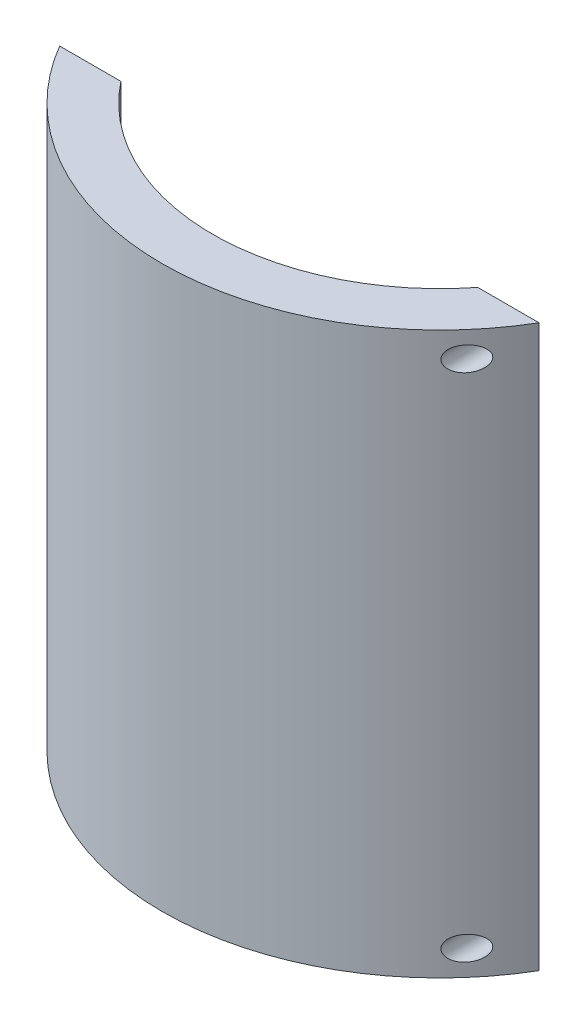
ISO-10303-21;
HEADER;
FILE_DESCRIPTION(('STEP AP214'),'2;1');
FILE_NAME('part.step','',(''),(''),'','','');
FILE_SCHEMA(('AUTOMOTIVE_DESIGN { 1 0 10303 214 1 1 1 1 }'));
ENDSEC;
DATA;
#1=APPLICATION_CONTEXT('core data for automotive mechanical design processes');
#2=APPLICATION_PROTOCOL_DEFINITION('international standard','automotive_design',2000,#1);
#3=PRODUCT_CONTEXT('',#1,'mechanical');
#4=PRODUCT('Part','Part','',(#3));
#5=PRODUCT_RELATED_PRODUCT_CATEGORY('part','',(#4));
#6=PRODUCT_DEFINITION_FORMATION('','',#4);
#7=PRODUCT_DEFINITION_CONTEXT('part definition',#1,'design');
#8=PRODUCT_DEFINITION('design','',#6,#7);
#9=PRODUCT_DEFINITION_SHAPE('','',#8);
#10=(LENGTH_UNIT() NAMED_UNIT(*) SI_UNIT(.MILLI.,.METRE.));
#11=(NAMED_UNIT(*) PLANE_ANGLE_UNIT() SI_UNIT($,.RADIAN.));
#12=(NAMED_UNIT(*) SI_UNIT($,.STERADIAN.) SOLID_ANGLE_UNIT());
#13=UNCERTAINTY_MEASURE_WITH_UNIT(LENGTH_MEASURE(1.E-05),#10,'distance_accuracy_value','');
#14=(GEOMETRIC_REPRESENTATION_CONTEXT(3) GLOBAL_UNCERTAINTY_ASSIGNED_CONTEXT((#13)) GLOBAL_UNIT_ASSIGNED_CONTEXT((#10,
#11,#12)) REPRESENTATION_CONTEXT('',''));
#15=CARTESIAN_POINT('',(0.,0.,0.));
#16=DIRECTION('',(0.,0.,1.));
#17=DIRECTION('',(1.,0.,0.));
#18=AXIS2_PLACEMENT_3D('',#15,#16,#17);
#19=CARTESIAN_POINT('',(0.,100.,0.));
#20=DIRECTION('',(0.,-1.,0.));
#21=DIRECTION('',(0.,0.,-1.));
#22=AXIS2_PLACEMENT_3D('',#19,#20,#21);
#23=CYLINDRICAL_SURFACE('',#22,49.53);
#24=CARTESIAN_POINT('',(-39.4074213026585,95.4875,30.0046004185155));
#25=CARTESIAN_POINT('',(-39.4074138231164,95.5760868129722,30.0046106623828));
#26=CARTESIAN_POINT('',(-39.4018732165979,95.6648574769952,30.0118914222295));
#27=CARTESIAN_POINT('',(-39.380325323203,95.8389843560618,30.0401592760915));
#28=CARTESIAN_POINT('',(-39.3642834079076,95.9243282796565,30.0611917164601));
#29=CARTESIAN_POINT('',(-39.3235497119811,96.0880486339832,30.1144555127511));
#30=CARTESIAN_POINT('',(-39.2989550782755,96.1664914129335,30.1465610614093));
#31=CARTESIAN_POINT('',(-39.2428451637457,96.3163587797536,30.2195653243151));
#32=CARTESIAN_POINT('',(-39.2113295048654,96.38778298393,30.2604645189069));
#33=CARTESIAN_POINT('',(-39.1234940657775,96.5619603112001,30.3740138610011));
#34=CARTESIAN_POINT('',(-39.063237154635,96.6595381602939,30.4515250234117));
#35=CARTESIAN_POINT('',(-38.9336345864392,96.8384508072716,30.6170560879879));
#36=CARTESIAN_POINT('',(-38.8642635793413,96.919738641746,30.7051052374441));
#37=CARTESIAN_POINT('',(-38.735223910005,97.0511756845679,30.8676467657953));
#38=CARTESIAN_POINT('',(-38.6768065524496,97.104234656769,30.9408258600599));
#39=CARTESIAN_POINT('',(-38.5568755767306,97.2021181689345,31.0901498276415));
#40=CARTESIAN_POINT('',(-38.4953603277594,97.2469383128071,31.1662962581658));
#41=CARTESIAN_POINT('',(-38.3697923598375,97.3289008284305,31.3207576197371));
#42=CARTESIAN_POINT('',(-38.3057365649727,97.3660335322998,31.3990751425921));
#43=CARTESIAN_POINT('',(-38.1756040575122,97.4329546408861,31.5571647116969));
#44=CARTESIAN_POINT('',(-38.1095269088684,97.4627414482017,31.6369370702647));
#45=CARTESIAN_POINT('',(-37.9564997982464,97.5227766544738,31.8204823103111));
#46=CARTESIAN_POINT('',(-37.8690061634527,97.550700007981,31.9245673144918));
#47=CARTESIAN_POINT('',(-37.6919351668351,97.5951125576892,32.133435661651));
#48=CARTESIAN_POINT('',(-37.6023571242215,97.6115979623823,32.2382192245818));
#49=CARTESIAN_POINT('',(-37.4217490065982,97.633138640976,32.4476919097323));
#50=CARTESIAN_POINT('',(-37.3307191892058,97.6381959205614,32.5523810453002));
#51=CARTESIAN_POINT('',(-37.1478653498557,97.6366512111041,32.7608951322289));
#52=CARTESIAN_POINT('',(-37.0560415908326,97.6300529452326,32.8647203489108));
#53=CARTESIAN_POINT('',(-36.8184113938012,97.5973435113219,33.1311524029261));
#54=CARTESIAN_POINT('',(-36.6724497812492,97.5620753193793,33.2926145437908));
#55=CARTESIAN_POINT('',(-36.3840203201293,97.4580637085691,33.6075781105172));
#56=CARTESIAN_POINT('',(-36.2415461676194,97.3893862310197,33.7610945614783));
#57=CARTESIAN_POINT('',(-36.0096410956516,97.241916493566,34.0080242092027));
#58=CARTESIAN_POINT('',(-35.9176932566001,97.1732041402113,34.1050826890571));
#59=CARTESIAN_POINT('',(-35.7412139110342,97.0163927006863,34.2899801725934));
#60=CARTESIAN_POINT('',(-35.6566726793137,96.9283195862632,34.3778312966434));
#61=CARTESIAN_POINT('',(-35.5183512478225,96.7552835096315,34.5206467005145));
#62=CARTESIAN_POINT('',(-35.4620649684157,96.6746748913579,34.5784369836505));
#63=CARTESIAN_POINT('',(-35.3589425380408,96.5015934598034,34.6838795803548));
#64=CARTESIAN_POINT('',(-35.3120938689752,96.409136632121,34.7315453277914));
#65=CARTESIAN_POINT('',(-35.2383324150464,96.2313287723595,34.8063655728462));
#66=CARTESIAN_POINT('',(-35.209342304374,96.1477545281004,34.8356751263186));
#67=CARTESIAN_POINT('',(-35.1614789616455,95.9748896511483,34.8839857617827));
#68=CARTESIAN_POINT('',(-35.1425994740157,95.8856025914239,34.9029932179039));
#69=CARTESIAN_POINT('',(-35.1162751766008,95.7031863861163,34.9294786914514));
#70=CARTESIAN_POINT('',(-35.1088872005874,95.6100404686669,34.9368994048088));
#71=CARTESIAN_POINT('',(-35.1063527542239,95.4234150648437,34.9394462242066));
#72=CARTESIAN_POINT('',(-35.1112044871775,95.3299356294393,34.9345741347371));
#73=CARTESIAN_POINT('',(-35.1318539376337,95.1532182214903,34.9138070024389));
#74=CARTESIAN_POINT('',(-35.1467418027374,95.0697604628312,34.898828121165));
#75=CARTESIAN_POINT('',(-35.1855208815022,94.9072289131094,34.8597299611378));
#76=CARTESIAN_POINT('',(-35.2094135570962,94.8281558362933,34.8356091981945));
#77=CARTESIAN_POINT('',(-35.2667974726932,94.6705357178912,34.7775166073731));
#78=CARTESIAN_POINT('',(-35.3008358573577,94.5923988985596,34.7429813474109));
#79=CARTESIAN_POINT('',(-35.3760037144262,94.4435980765386,34.6664412705542));
#80=CARTESIAN_POINT('',(-35.417137382314,94.3729385353227,34.6244320337876));
#81=CARTESIAN_POINT('',(-35.5299264067506,94.2014339552819,34.5087651492001));
#82=CARTESIAN_POINT('',(-35.6056500593238,94.1062317172952,34.4306817284873));
#83=CARTESIAN_POINT('',(-35.7660751274733,93.9343495737967,34.2640083456365));
#84=CARTESIAN_POINT('',(-35.8507990044313,93.8577176531012,34.1753920283989));
#85=CARTESIAN_POINT('',(-36.0626614322262,93.6931048909754,33.9519927704));
#86=CARTESIAN_POINT('',(-36.1926527419706,93.6139050600469,33.813467609748));
#87=CARTESIAN_POINT('',(-36.457695064856,93.4863485978922,33.5275344915405));
#88=CARTESIAN_POINT('',(-36.5927520073855,93.438029386331,33.3801159931773));
#89=CARTESIAN_POINT('',(-36.8177287101173,93.3809282007733,33.1314589024013));
#90=CARTESIAN_POINT('',(-36.9073247580851,93.3642811059893,33.0316275869655));
#91=CARTESIAN_POINT('',(-37.0863471987778,93.3424193311821,32.8305019741674));
#92=CARTESIAN_POINT('',(-37.1757735271239,93.3372083572626,32.7292072132478));
#93=CARTESIAN_POINT('',(-37.3539759341414,93.337817476613,32.5256780091543));
#94=CARTESIAN_POINT('',(-37.4427499871171,93.3436635604049,32.4234419155044));
#95=CARTESIAN_POINT('',(-37.6188530062927,93.3662393623677,32.218954049226));
#96=CARTESIAN_POINT('',(-37.7061821999941,93.3829673500704,32.1167022816743));
#97=CARTESIAN_POINT('',(-37.8798218577766,93.4275862056203,31.9117257234516));
#98=CARTESIAN_POINT('',(-37.9661097342875,93.4556008069972,31.8090085980288));
#99=CARTESIAN_POINT('',(-38.1360494806427,93.523097654805,31.6050668334092));
#100=CARTESIAN_POINT('',(-38.2197002171455,93.5625847591659,31.5038428455871));
#101=CARTESIAN_POINT('',(-38.3832054348917,93.6534269681223,31.3044244922944));
#102=CARTESIAN_POINT('',(-38.4630742545531,93.704732043577,31.2062192798366));
#103=CARTESIAN_POINT('',(-38.6182614236944,93.8201790706429,31.0139646651233));
#104=CARTESIAN_POINT('',(-38.6935851780397,93.8843053677164,30.9199103639727));
#105=CARTESIAN_POINT('',(-38.8306499406241,94.0192667175621,30.7475584949108));
#106=CARTESIAN_POINT('',(-38.8929871489425,94.0886945015833,30.6686426018036));
#107=CARTESIAN_POINT('',(-39.0111624109502,94.2400631846726,30.5181785397325));
#108=CARTESIAN_POINT('',(-39.0670058740575,94.3219935353627,30.4466242442241));
#109=CARTESIAN_POINT('',(-39.1607343936026,94.4839725222935,30.3259390981216));
#110=CARTESIAN_POINT('',(-39.2000539395629,94.5618761447576,30.2750721991341));
#111=CARTESIAN_POINT('',(-39.2704389726716,94.7270542391685,30.1837182464972));
#112=CARTESIAN_POINT('',(-39.3015149387161,94.8143166144696,30.1432180174889));
#113=CARTESIAN_POINT('',(-39.3471431700817,94.9766166224877,30.0836220095453));
#114=CARTESIAN_POINT('',(-39.3638356077838,95.050033214707,30.0617661161455));
#115=CARTESIAN_POINT('',(-39.3895127343172,95.2003500996871,30.0281142732415));
#116=CARTESIAN_POINT('',(-39.3985194966368,95.2772397434504,30.0162895145977));
#117=CARTESIAN_POINT('',(-39.4046836715937,95.3767864694956,30.0081956538399));
#118=CARTESIAN_POINT('',(-39.4057084934667,95.3988906922526,30.0068498868564));
#119=CARTESIAN_POINT('',(-39.407078309968,95.4431594291627,30.0050509019545));
#120=CARTESIAN_POINT('',(-39.4074231750214,95.4653239540016,30.0045978541556));
#121=CARTESIAN_POINT('',(-39.4074213026585,95.4875,30.0046004185155));
#122=B_SPLINE_CURVE_WITH_KNOTS('',3,(#24,#25,#26,#27,#28,#29,#30,#31,#32,#33,#34,#35,#36,#37,
#38,#39,#40,#41,#42,#43,#44,#45,#46,#47,#48,#49,#50,#51,#52,#53,#54,#55,#56,#57,#58,#59,#60,#61,
#62,#63,#64,#65,#66,#67,#68,#69,#70,#71,#72,#73,#74,#75,#76,#77,#78,#79,#80,#81,#82,#83,#84,#85,
#86,#87,#88,#89,#90,#91,#92,#93,#94,#95,#96,#97,#98,#99,#100,#101,#102,#103,#104,#105,#106,#107,
#108,#109,#110,#111,#112,#113,#114,#115,#116,#117,#118,#119,#120,#121),.UNSPECIFIED.,.T.,.F.,(4,
2,2,2,2,2,2,2,2,2,2,2,2,2,2,2,2,2,2,2,2,2,2,2,2,2,2,2,2,2,2,2,2,2,2,2,2,2,2,2,2,2,2,2,2,2,2,2,
4),(0.,0.265642847989677,0.53216610490517,0.795755908641338,1.05936011436871,1.47230402326807,
1.88642182666588,2.20887407933402,2.53149789048016,2.85452500768746,3.17762230692878,
3.59352643056691,4.00956835438167,4.42553725538738,4.84137330603983,5.50047583259071,
6.15828270661571,6.60790597471601,7.05692973099748,7.39786992096962,7.73835486446586,
8.01677542098895,8.29502351549374,8.57464341969228,8.85422228020193,9.11136036662956,
9.36854021747783,9.64340825488554,9.91843938409714,10.3496426033114,10.7819484263127,
11.396064542911,12.010923412259,12.4159723627421,12.8211525580639,13.2272863465089,
13.6333555662988,14.044003164276,14.454824901405,14.8639384651731,15.2725555242503,
15.6383517570677,16.0038410578006,16.3058463735576,16.6074659328711,16.8417375515072,
17.0753340485162,17.1418200812611,17.2083187825746),.UNSPECIFIED.);
#123=CARTESIAN_POINT('',(-39.4074213026585,95.4875,30.0046004185155));
#124=VERTEX_POINT('',#123);
#125=EDGE_CURVE('E164',#124,#124,#122,.T.);
#126=ORIENTED_EDGE('',*,*,#125,.T.);
#127=EDGE_LOOP('',(#126));
#128=FACE_BOUND('',#127,.T.);
#129=CARTESIAN_POINT('',(35.1074213026585,4.5125,34.9383724503252));
#130=CARTESIAN_POINT('',(35.107429595275,4.607648641169,34.9383645722318));
#131=CARTESIAN_POINT('',(35.1137985669393,4.70293165044877,34.9319679330003));
#132=CARTESIAN_POINT('',(35.1387547842894,4.89030288594975,34.9068632967998));
#133=CARTESIAN_POINT('',(35.1573682494875,4.98238380895426,34.8881288804715));
#134=CARTESIAN_POINT('',(35.2051898288034,5.15999417959315,34.8398713846146));
#135=CARTESIAN_POINT('',(35.2343247087403,5.24556408049264,34.8104228701065));
#136=CARTESIAN_POINT('',(35.3013546509561,5.40923954916148,34.7424457787171));
#137=CARTESIAN_POINT('',(35.3392511108243,5.48734392326702,34.7039157531941));
#138=CARTESIAN_POINT('',(35.4384275345719,5.66479858753594,34.6026807808897));
#139=CARTESIAN_POINT('',(35.5030195204092,5.76028325302555,34.5364495438225));
#140=CARTESIAN_POINT('',(35.6415780608479,5.93519398446631,34.3934411804617));
#141=CARTESIAN_POINT('',(35.7155641643841,6.01458564007963,34.3166420338599));
#142=CARTESIAN_POINT('',(35.9015801198949,6.18771526217042,34.1221647858421));
#143=CARTESIAN_POINT('',(36.0167053729792,6.27384331620684,34.0007002291642));
#144=CARTESIAN_POINT('',(36.2534047213287,6.41874118481925,33.7482096325389));
#145=CARTESIAN_POINT('',(36.3749888337179,6.47746703436828,33.6171686146759));
#146=CARTESIAN_POINT('',(36.5822048151743,6.55570540057249,33.3912986258704));
#147=CARTESIAN_POINT('',(36.6671492034687,6.58174011667513,33.2980063924323));
#148=CARTESIAN_POINT('',(36.8375261678406,6.62292041525108,33.1094201391493));
#149=CARTESIAN_POINT('',(36.9229589117807,6.63806199434846,33.0141253965838));
#150=CARTESIAN_POINT('',(37.0937172964743,6.65798357485536,32.8221506459239));
#151=CARTESIAN_POINT('',(37.1790426223491,6.66274911603871,32.7254688933741));
#152=CARTESIAN_POINT('',(37.3489056683861,6.66223091195811,32.531473446686));
#153=CARTESIAN_POINT('',(37.4334434930271,6.65694851940919,32.4341598393697));
#154=CARTESIAN_POINT('',(37.6027887559117,6.63632458287057,32.2376845399482));
#155=CARTESIAN_POINT('',(37.6875726441901,6.62080012219108,32.1385217223893));
#156=CARTESIAN_POINT('',(37.8553284136661,6.57949577378703,31.9407549570769));
#157=CARTESIAN_POINT('',(37.9382998893924,6.5537136155118,31.8421511379627));
#158=CARTESIAN_POINT('',(38.1017093262379,6.49171755906566,31.6464352265446));
#159=CARTESIAN_POINT('',(38.1821516966005,6.45552307722344,31.5493207088744));
#160=CARTESIAN_POINT('',(38.3399517869156,6.3722264243901,31.3573663638389));
#161=CARTESIAN_POINT('',(38.417311301015,6.3251307096119,31.2625252266186));
#162=CARTESIAN_POINT('',(38.5811016718747,6.21015903153788,31.060250815592));
#163=CARTESIAN_POINT('',(38.6668099471602,6.14010365393339,30.9534509063295));
#164=CARTESIAN_POINT('',(38.8307861552442,5.98218251117819,30.7474907277623));
#165=CARTESIAN_POINT('',(38.9090628847949,5.89433819889874,30.6483214530898));
#166=CARTESIAN_POINT('',(39.0358207822244,5.72408277329454,30.4866081734568));
#167=CARTESIAN_POINT('',(39.086755146623,5.64620520104136,30.4212483760594));
#168=CARTESIAN_POINT('',(39.1804869857688,5.47867524618002,30.300431517573));
#169=CARTESIAN_POINT('',(39.2232983773537,5.38904345566584,30.2449575295308));
#170=CARTESIAN_POINT('',(39.288050968751,5.22298120358018,30.1607694991279));
#171=CARTESIAN_POINT('',(39.3125241659815,5.14918234360227,30.128848215701));
#172=CARTESIAN_POINT('',(39.3538427993996,4.9960165320773,30.0748585510629));
#173=CARTESIAN_POINT('',(39.3706954943331,4.91665496276928,30.0527807938937));
#174=CARTESIAN_POINT('',(39.3954806986278,4.75345198860808,30.0202837879126));
#175=CARTESIAN_POINT('',(39.4033380561212,4.66957888437785,30.0099627646759));
#176=CARTESIAN_POINT('',(39.409042447484,4.50091346040258,30.0024716081159));
#177=CARTESIAN_POINT('',(39.4068939533663,4.41612156820294,30.0052955997626));
#178=CARTESIAN_POINT('',(39.3936996796875,4.25897020950953,30.0226149925182));
#179=CARTESIAN_POINT('',(39.3837605378003,4.18634666574626,30.0356586305719));
#180=CARTESIAN_POINT('',(39.3571231905393,4.04456490517971,30.0705542735786));
#181=CARTESIAN_POINT('',(39.3404218503801,3.97540831230039,30.0924103637435));
#182=CARTESIAN_POINT('',(39.2937508719582,3.81596551829538,30.1533415241384));
#183=CARTESIAN_POINT('',(39.2611490876691,3.72775114254554,30.1958057057852));
#184=CARTESIAN_POINT('',(39.1875866855957,3.56102170852366,30.2912131962625));
#185=CARTESIAN_POINT('',(39.1466076025664,3.48252870264735,30.3441796463049));
#186=CARTESIAN_POINT('',(39.0363174824866,3.29813663312304,30.4860353556109));
#187=CARTESIAN_POINT('',(38.9631016125096,3.19822378597992,30.5796223455535));
#188=CARTESIAN_POINT('',(38.807361131171,3.01769493344924,30.7770294949116));
#189=CARTESIAN_POINT('',(38.7248161843506,2.93712232734071,30.8808719444865));
#190=CARTESIAN_POINT('',(38.5732306146981,2.81000217625442,31.0698871569843));
#191=CARTESIAN_POINT('',(38.5055163746478,2.75989982199942,31.1537824459846));
#192=CARTESIAN_POINT('',(38.3670357785775,2.66910161094825,31.3241682682319));
#193=CARTESIAN_POINT('',(38.2962678651985,2.62841062281958,31.410660118705));
#194=CARTESIAN_POINT('',(38.1522676850961,2.55590824030483,31.5854112844813));
#195=CARTESIAN_POINT('',(38.0790333073223,2.52410468084659,31.6736720862568));
#196=CARTESIAN_POINT('',(37.9306520590613,2.46909111754888,31.8512154028364));
#197=CARTESIAN_POINT('',(37.8555055037881,2.44587970701535,31.9404977479252));
#198=CARTESIAN_POINT('',(37.7009433145527,2.40718256055546,32.122804219019));
#199=CARTESIAN_POINT('',(37.6214715731134,2.39200657420854,32.2158468957634));
#200=CARTESIAN_POINT('',(37.4613197100587,2.37066609213241,32.4019374454449));
#201=CARTESIAN_POINT('',(37.3806391454461,2.36450498593891,32.4949853071885));
#202=CARTESIAN_POINT('',(37.137533629785,2.359731580918,32.7732330577328));
#203=CARTESIAN_POINT('',(36.973811050865,2.37477072028966,32.9578130097226));
#204=CARTESIAN_POINT('',(36.6739790677308,2.43846565458303,33.290870781928));
#205=CARTESIAN_POINT('',(36.5377052768172,2.48126243587731,33.4403416429182));
#206=CARTESIAN_POINT('',(36.269386705508,2.59739902011383,33.7311624190366));
#207=CARTESIAN_POINT('',(36.1373359648777,2.67069352730021,33.8725240253484));
#208=CARTESIAN_POINT('',(35.9215680157307,2.82435057132763,34.1010072122144));
#209=CARTESIAN_POINT('',(35.8352891375765,2.89590770537539,34.191624958061));
#210=CARTESIAN_POINT('',(35.6706010017828,3.05725161628043,34.3633987504105));
#211=CARTESIAN_POINT('',(35.5921803121429,3.14701131962318,34.4445685702833));
#212=CARTESIAN_POINT('',(35.4646723196942,3.32198491341985,34.5757752969511));
#213=CARTESIAN_POINT('',(35.413041310457,3.40321756377505,34.6286282018128));
#214=CARTESIAN_POINT('',(35.319339119602,3.57654896390219,34.7241940818748));
#215=CARTESIAN_POINT('',(35.2772592801793,3.66863775695485,34.7669162418291));
#216=CARTESIAN_POINT('',(35.21149294611,3.84610120386201,34.8335110243728));
#217=CARTESIAN_POINT('',(35.1859096022799,3.93003589094755,34.859338695775));
#218=CARTESIAN_POINT('',(35.1449789225271,4.10273003551784,34.9006048217041));
#219=CARTESIAN_POINT('',(35.1296073443229,4.1914775214388,34.9160678821492));
#220=CARTESIAN_POINT('',(35.1157455317954,4.31958950269252,34.9300063322382));
#221=CARTESIAN_POINT('',(35.1126304361898,4.35802818120758,34.9331374743631));
#222=CARTESIAN_POINT('',(35.1084664059003,4.43513713341637,34.9373223660921));
#223=CARTESIAN_POINT('',(35.1074179304356,4.47380745666903,34.9383756539807));
#224=CARTESIAN_POINT('',(35.1074213026585,4.5125,34.9383724503252));
#225=B_SPLINE_CURVE_WITH_KNOTS('',3,(#129,#130,#131,#132,#133,#134,#135,#136,#137,#138,#139,
#140,#141,#142,#143,#144,#145,#146,#147,#148,#149,#150,#151,#152,#153,#154,#155,#156,#157,#158,
#159,#160,#161,#162,#163,#164,#165,#166,#167,#168,#169,#170,#171,#172,#173,#174,#175,#176,#177,
#178,#179,#180,#181,#182,#183,#184,#185,#186,#187,#188,#189,#190,#191,#192,#193,#194,#195,#196,
#197,#198,#199,#200,#201,#202,#203,#204,#205,#206,#207,#208,#209,#210,#211,#212,#213,#214,#215,
#216,#217,#218,#219,#220,#221,#222,#223,#224),.UNSPECIFIED.,.T.,.F.,(4,2,2,2,2,2,2,2,2,2,2,2,2,
2,2,2,2,2,2,2,2,2,2,2,2,2,2,2,2,2,2,2,2,2,2,2,2,2,2,2,2,2,2,2,2,2,2,4),(0.,0.285270715967287,
0.571154288098844,0.855085158667696,1.13906135129693,1.53570850354186,1.93319502893187,
2.49479059151589,3.05728412487375,3.44331105427258,3.82947978144198,4.21618633649214,
4.6028408343968,4.9965947521236,5.39043587617143,5.78354729534068,6.17642648881404,
6.63675189211781,7.09652542914813,7.43666766553581,7.77622177802255,8.0274426656316,
8.2784237514762,8.53148670755086,8.78443657058541,9.00681683645588,9.22930031048277,
9.53713417552582,9.845654029287,10.308831566777,10.7730389510628,11.1292422598855,
11.4856294289223,11.8423297956075,12.1989717379746,12.5685113398517,12.9381898505187,
13.6764580075554,14.2947733148968,14.9121735490144,15.3432860738918,15.7737620272601,
16.1020241031356,16.4299874217749,16.7032769524739,16.9759153651479,17.0918959774571,
17.2079023586624),.UNSPECIFIED.);
#226=CARTESIAN_POINT('',(35.1074213026585,4.5125,34.9383724503252));
#227=VERTEX_POINT('',#226);
#228=EDGE_CURVE('E114',#227,#227,#225,.T.);
#229=ORIENTED_EDGE('',*,*,#228,.T.);
#230=EDGE_LOOP('',(#229));
#231=FACE_BOUND('',#230,.T.);
#232=CARTESIAN_POINT('',(0.,0.,0.));
#233=DIRECTION('',(0.,1.,0.));
#234=DIRECTION('',(0.,0.,1.));
#235=AXIS2_PLACEMENT_3D('',#232,#233,#234);
#236=CIRCLE('',#235,49.53);
#237=CARTESIAN_POINT('',(-42.7166946286812,0.,25.07));
#238=VERTEX_POINT('',#237);
#239=CARTESIAN_POINT('',(42.7166946286812,0.,25.07));
#240=VERTEX_POINT('',#239);
#241=EDGE_CURVE('E116',#238,#240,#236,.T.);
#242=ORIENTED_EDGE('',*,*,#241,.T.);
#243=DIRECTION('',(0.,-1.,0.));
#244=VECTOR('',#243,1.);
#245=CARTESIAN_POINT('',(42.7166946286812,100.,25.07));
#246=LINE('',#245,#244);
#247=CARTESIAN_POINT('',(42.7166946286812,100.,25.07));
#248=VERTEX_POINT('',#247);
#249=EDGE_CURVE('E78',#248,#240,#246,.T.);
#250=ORIENTED_EDGE('',*,*,#249,.F.);
#251=CARTESIAN_POINT('',(0.,100.,0.));
#252=DIRECTION('',(0.,1.,0.));
#253=DIRECTION('',(0.,0.,1.));
#254=AXIS2_PLACEMENT_3D('',#251,#252,#253);
#255=CIRCLE('',#254,49.53);
#256=CARTESIAN_POINT('',(-42.7166946286812,100.,25.07));
#257=VERTEX_POINT('',#256);
#258=EDGE_CURVE('E95',#257,#248,#255,.T.);
#259=ORIENTED_EDGE('',*,*,#258,.F.);
#260=DIRECTION('',(0.,-1.,0.));
#261=VECTOR('',#260,1.);
#262=CARTESIAN_POINT('',(-42.7166946286812,100.,25.07));
#263=LINE('',#262,#261);
#264=EDGE_CURVE('E56',#257,#238,#263,.T.);
#265=ORIENTED_EDGE('',*,*,#264,.T.);
#266=EDGE_LOOP('',(#242,#250,#259,#265));
#267=FACE_BOUND('',#266,.T.);
#268=CARTESIAN_POINT('',(-39.4074213026585,4.5125,30.0046004185155));
#269=CARTESIAN_POINT('',(-39.4074138231164,4.42391318702777,30.0046106623828));
#270=CARTESIAN_POINT('',(-39.4018732165979,4.3351425230048,30.0118914222295));
#271=CARTESIAN_POINT('',(-39.380325323203,4.16101564393822,30.0401592760915));
#272=CARTESIAN_POINT('',(-39.3642834079076,4.07567172034347,30.0611917164601));
#273=CARTESIAN_POINT('',(-39.3235497119811,3.91195136601683,30.1144555127511));
#274=CARTESIAN_POINT('',(-39.2989550782755,3.83350858706648,30.1465610614093));
#275=CARTESIAN_POINT('',(-39.2428451637457,3.68364122024637,30.2195653243151));
#276=CARTESIAN_POINT('',(-39.2113295048654,3.61221701606996,30.260464518907));
#277=CARTESIAN_POINT('',(-39.1234940657775,3.43803968879993,30.3740138610011));
#278=CARTESIAN_POINT('',(-39.0632371546349,3.34046183970609,30.4515250234117));
#279=CARTESIAN_POINT('',(-38.9336345864392,3.16154919272841,30.6170560879879));
#280=CARTESIAN_POINT('',(-38.8642635793414,3.08026135825403,30.7051052374441));
#281=CARTESIAN_POINT('',(-38.7352239100051,2.94882431543213,30.8676467657953));
#282=CARTESIAN_POINT('',(-38.6768065524496,2.89576534323101,30.9408258600599));
#283=CARTESIAN_POINT('',(-38.5568755767306,2.79788183106548,31.0901498276415));
#284=CARTESIAN_POINT('',(-38.4953603277594,2.75306168719286,31.1662962581658));
#285=CARTESIAN_POINT('',(-38.3697923598375,2.67109917156946,31.320757619737));
#286=CARTESIAN_POINT('',(-38.3057365649727,2.63396646770026,31.3990751425921));
#287=CARTESIAN_POINT('',(-38.1756040575122,2.56704535911387,31.5571647116969));
#288=CARTESIAN_POINT('',(-38.1095269088684,2.53725855179833,31.6369370702647));
#289=CARTESIAN_POINT('',(-37.9564997982464,2.47722334552619,31.8204823103111));
#290=CARTESIAN_POINT('',(-37.8690061634527,2.44929999201902,31.9245673144918));
#291=CARTESIAN_POINT('',(-37.6919351668351,2.40488744231078,32.133435661651));
#292=CARTESIAN_POINT('',(-37.6023571242215,2.38840203761767,32.2382192245817));
#293=CARTESIAN_POINT('',(-37.4217490065982,2.36686135902401,32.4476919097323));
#294=CARTESIAN_POINT('',(-37.3307191892058,2.36180407943864,32.5523810453002));
#295=CARTESIAN_POINT('',(-37.1478653498557,2.36334878889589,32.7608951322289));
#296=CARTESIAN_POINT('',(-37.0560415908326,2.36994705476744,32.8647203489107));
#297=CARTESIAN_POINT('',(-36.8184113938012,2.40265648867811,33.1311524029261));
#298=CARTESIAN_POINT('',(-36.6724497812492,2.43792468062067,33.2926145437908));
#299=CARTESIAN_POINT('',(-36.3840203201293,2.54193629143086,33.6075781105172));
#300=CARTESIAN_POINT('',(-36.2415461676194,2.61061376898034,33.7610945614783));
#301=CARTESIAN_POINT('',(-36.0096410956516,2.75808350643405,34.0080242092028));
#302=CARTESIAN_POINT('',(-35.9176932566001,2.82679585978871,34.1050826890571));
#303=CARTESIAN_POINT('',(-35.7412139110342,2.98360729931375,34.2899801725934));
#304=CARTESIAN_POINT('',(-35.6566726793137,3.07168041373683,34.3778312966434));
#305=CARTESIAN_POINT('',(-35.5183512478225,3.24471649036854,34.5206467005145));
#306=CARTESIAN_POINT('',(-35.4620649684157,3.3253251086421,34.5784369836505));
#307=CARTESIAN_POINT('',(-35.3589425380408,3.49840654019663,34.6838795803548));
#308=CARTESIAN_POINT('',(-35.3120938689752,3.59086336787904,34.7315453277914));
#309=CARTESIAN_POINT('',(-35.2383324150464,3.76867122764056,34.8063655728462));
#310=CARTESIAN_POINT('',(-35.209342304374,3.85224547189957,34.8356751263186));
#311=CARTESIAN_POINT('',(-35.1614789616455,4.02511034885173,34.8839857617827));
#312=CARTESIAN_POINT('',(-35.1425994740157,4.11439740857607,34.9029932179039));
#313=CARTESIAN_POINT('',(-35.1162751766008,4.29681361388371,34.9294786914514));
#314=CARTESIAN_POINT('',(-35.1088872005874,4.38995953133313,34.9368994048088));
#315=CARTESIAN_POINT('',(-35.1063527542239,4.57658493515633,34.9394462242066));
#316=CARTESIAN_POINT('',(-35.1112044871775,4.6700643705607,34.9345741347371));
#317=CARTESIAN_POINT('',(-35.1318539376336,4.84678177850967,34.9138070024389));
#318=CARTESIAN_POINT('',(-35.1467418027374,4.93023953716885,34.898828121165));
#319=CARTESIAN_POINT('',(-35.1855208815022,5.09277108689064,34.8597299611378));
#320=CARTESIAN_POINT('',(-35.2094135570962,5.17184416370669,34.8356091981945));
#321=CARTESIAN_POINT('',(-35.2667974726932,5.32946428210883,34.7775166073731));
#322=CARTESIAN_POINT('',(-35.3008358573577,5.40760110144042,34.7429813474109));
#323=CARTESIAN_POINT('',(-35.3760037144262,5.55640192346136,34.6664412705542));
#324=CARTESIAN_POINT('',(-35.417137382314,5.62706146467733,34.6244320337876));
#325=CARTESIAN_POINT('',(-35.5299264067506,5.79856604471811,34.5087651492001));
#326=CARTESIAN_POINT('',(-35.6056500593238,5.89376828270479,34.4306817284873));
#327=CARTESIAN_POINT('',(-35.7660751274733,6.06565042620328,34.2640083456366));
#328=CARTESIAN_POINT('',(-35.8507990044312,6.14228234689874,34.1753920283989));
#329=CARTESIAN_POINT('',(-36.0626614322262,6.30689510902458,33.9519927704001));
#330=CARTESIAN_POINT('',(-36.1926527419706,6.3860949399531,33.8134676097481));
#331=CARTESIAN_POINT('',(-36.457695064856,6.51365140210776,33.5275344915406));
#332=CARTESIAN_POINT('',(-36.5927520073854,6.56197061366895,33.3801159931774));
#333=CARTESIAN_POINT('',(-36.8177287101173,6.61907179922665,33.1314589024013));
#334=CARTESIAN_POINT('',(-36.9073247580851,6.63571889401066,33.0316275869656));
#335=CARTESIAN_POINT('',(-37.0863471987777,6.65758066881786,32.8305019741675));
#336=CARTESIAN_POINT('',(-37.1757735271238,6.66279164273745,32.7292072132479));
#337=CARTESIAN_POINT('',(-37.3539759341413,6.66218252338702,32.5256780091544));
#338=CARTESIAN_POINT('',(-37.4427499871171,6.65633643959513,32.4234419155045));
#339=CARTESIAN_POINT('',(-37.6188530062927,6.63376063763229,32.218954049226));
#340=CARTESIAN_POINT('',(-37.706182199994,6.61703264992963,32.1167022816743));
#341=CARTESIAN_POINT('',(-37.8798218577765,6.57241379437968,31.9117257234516));
#342=CARTESIAN_POINT('',(-37.9661097342875,6.54439919300288,31.8090085980289));
#343=CARTESIAN_POINT('',(-38.1360494806426,6.47690234519501,31.6050668334093));
#344=CARTESIAN_POINT('',(-38.2197002171454,6.43741524083408,31.5038428455872));
#345=CARTESIAN_POINT('',(-38.3832054348916,6.34657303187775,31.3044244922944));
#346=CARTESIAN_POINT('',(-38.4630742545531,6.2952679564231,31.2062192798367));
#347=CARTESIAN_POINT('',(-38.6182614236944,6.17982092935712,31.0139646651233));
#348=CARTESIAN_POINT('',(-38.6935851780397,6.11569463228369,30.9199103639727));
#349=CARTESIAN_POINT('',(-38.8306499406241,5.98073328243797,30.7475584949108));
#350=CARTESIAN_POINT('',(-38.8929871489425,5.91130549841679,30.6686426018036));
#351=CARTESIAN_POINT('',(-39.0111624109502,5.75993681532749,30.5181785397325));
#352=CARTESIAN_POINT('',(-39.0670058740575,5.67800646463739,30.4466242442242));
#353=CARTESIAN_POINT('',(-39.1607343936026,5.51602747770652,30.3259390981216));
#354=CARTESIAN_POINT('',(-39.2000539395629,5.43812385524241,30.2750721991342));
#355=CARTESIAN_POINT('',(-39.2704389726716,5.27294576083159,30.1837182464972));
#356=CARTESIAN_POINT('',(-39.3015149387161,5.18568338553046,30.1432180174889));
#357=CARTESIAN_POINT('',(-39.3471431700817,5.02338337751236,30.0836220095453));
#358=CARTESIAN_POINT('',(-39.3638356077838,4.94996678529303,30.0617661161455));
#359=CARTESIAN_POINT('',(-39.3895127343172,4.79964990031294,30.0281142732415));
#360=CARTESIAN_POINT('',(-39.3985194966368,4.72276025654965,30.0162895145977));
#361=CARTESIAN_POINT('',(-39.4046836715937,4.62321353050439,30.0081956538399));
#362=CARTESIAN_POINT('',(-39.4057084934667,4.60110930774744,30.0068498868564));
#363=CARTESIAN_POINT('',(-39.407078309968,4.55684057083726,30.0050509019545));
#364=CARTESIAN_POINT('',(-39.4074231750214,4.53467604599838,30.0045978541556));
#365=CARTESIAN_POINT('',(-39.4074213026585,4.5125,30.0046004185155));
#366=B_SPLINE_CURVE_WITH_KNOTS('',3,(#268,#269,#270,#271,#272,#273,#274,#275,#276,#277,#278,
#279,#280,#281,#282,#283,#284,#285,#286,#287,#288,#289,#290,#291,#292,#293,#294,#295,#296,#297,
#298,#299,#300,#301,#302,#303,#304,#305,#306,#307,#308,#309,#310,#311,#312,#313,#314,#315,#316,
#317,#318,#319,#320,#321,#322,#323,#324,#325,#326,#327,#328,#329,#330,#331,#332,#333,#334,#335,
#336,#337,#338,#339,#340,#341,#342,#343,#344,#345,#346,#347,#348,#349,#350,#351,#352,#353,#354,
#355,#356,#357,#358,#359,#360,#361,#362,#363,#364,#365),.UNSPECIFIED.,.T.,.F.,(4,2,2,2,2,2,2,2,
2,2,2,2,2,2,2,2,2,2,2,2,2,2,2,2,2,2,2,2,2,2,2,2,2,2,2,2,2,2,2,2,2,2,2,2,2,2,2,2,4),(0.,
0.265642847989675,0.532166104905169,0.795755908641353,1.05936011436872,1.47230402326808,
1.88642182666587,2.20887407933401,2.53149789048015,2.85452500768746,3.17762230692876,
3.59352643056691,4.00956835438167,4.42553725538738,4.84137330603982,5.50047583259071,
6.15828270661573,6.60790597471602,7.0569297309975,7.39786992096963,7.73835486446586,
8.01677542098895,8.29502351549374,8.57464341969228,8.85422228020193,9.11136036662956,
9.36854021747783,9.64340825488554,9.91843938409713,10.3496426033114,10.7819484263126,
11.396064542911,12.010923412259,12.415972362742,12.8211525580639,13.2272863465088,
13.6333555662987,14.0440031642759,14.4548249014049,14.863938465173,15.2725555242503,
15.6383517570676,16.0038410578005,16.3058463735576,16.6074659328711,16.8417375515072,
17.0753340485162,17.1418200812611,17.2083187825747),.UNSPECIFIED.);
#367=CARTESIAN_POINT('',(-39.4074213026585,4.5125,30.0046004185155));
#368=VERTEX_POINT('',#367);
#369=EDGE_CURVE('E45',#368,#368,#366,.T.);
#370=ORIENTED_EDGE('',*,*,#369,.F.);
#371=EDGE_LOOP('',(#370));
#372=FACE_BOUND('',#371,.T.);
#373=CARTESIAN_POINT('',(35.1074213026585,95.4875,34.9383724503252));
#374=CARTESIAN_POINT('',(35.107429595275,95.392351358831,34.9383645722318));
#375=CARTESIAN_POINT('',(35.1137985669393,95.2970683495512,34.9319679330003));
#376=CARTESIAN_POINT('',(35.1387547842894,95.1096971140503,34.9068632967998));
#377=CARTESIAN_POINT('',(35.1573682494875,95.0176161910457,34.8881288804715));
#378=CARTESIAN_POINT('',(35.2051898288034,94.8400058204069,34.8398713846146));
#379=CARTESIAN_POINT('',(35.2343247087403,94.7544359195074,34.8104228701065));
#380=CARTESIAN_POINT('',(35.3013546509561,94.5907604508385,34.7424457787171));
#381=CARTESIAN_POINT('',(35.3392511108243,94.512656076733,34.7039157531941));
#382=CARTESIAN_POINT('',(35.4384275345719,94.3352014124641,34.6026807808897));
#383=CARTESIAN_POINT('',(35.5030195204092,94.2397167469745,34.5364495438225));
#384=CARTESIAN_POINT('',(35.6415780608479,94.0648060155337,34.3934411804617));
#385=CARTESIAN_POINT('',(35.7155641643841,93.9854143599204,34.3166420338599));
#386=CARTESIAN_POINT('',(35.9015801198949,93.8122847378296,34.1221647858422));
#387=CARTESIAN_POINT('',(36.0167053729792,93.7261566837932,34.0007002291642));
#388=CARTESIAN_POINT('',(36.2534047213287,93.5812588151808,33.748209632539));
#389=CARTESIAN_POINT('',(36.3749888337179,93.5225329656317,33.6171686146759));
#390=CARTESIAN_POINT('',(36.5822048151743,93.4442945994275,33.3912986258704));
#391=CARTESIAN_POINT('',(36.6671492034687,93.4182598833249,33.2980063924323));
#392=CARTESIAN_POINT('',(36.8375261678406,93.3770795847489,33.1094201391493));
#393=CARTESIAN_POINT('',(36.9229589117807,93.3619380056516,33.0141253965839));
#394=CARTESIAN_POINT('',(37.0937172964743,93.3420164251446,32.8221506459239));
#395=CARTESIAN_POINT('',(37.179042622349,93.3372508839613,32.7254688933741));
#396=CARTESIAN_POINT('',(37.3489056683861,93.3377690880419,32.531473446686));
#397=CARTESIAN_POINT('',(37.4334434930271,93.3430514805908,32.4341598393697));
#398=CARTESIAN_POINT('',(37.6027887559117,93.3636754171294,32.2376845399483));
#399=CARTESIAN_POINT('',(37.68757264419,93.3791998778089,32.1385217223893));
#400=CARTESIAN_POINT('',(37.8553284136661,93.420504226213,31.9407549570769));
#401=CARTESIAN_POINT('',(37.9382998893924,93.4462863844882,31.8421511379627));
#402=CARTESIAN_POINT('',(38.1017093262379,93.5082824409343,31.6464352265446));
#403=CARTESIAN_POINT('',(38.1821516966005,93.5444769227766,31.5493207088744));
#404=CARTESIAN_POINT('',(38.3399517869156,93.6277735756099,31.3573663638389));
#405=CARTESIAN_POINT('',(38.417311301015,93.6748692903881,31.2625252266187));
#406=CARTESIAN_POINT('',(38.5811016718747,93.7898409684621,31.0602508155921));
#407=CARTESIAN_POINT('',(38.6668099471602,93.8598963460666,30.9534509063295));
#408=CARTESIAN_POINT('',(38.8307861552442,94.0178174888218,30.7474907277623));
#409=CARTESIAN_POINT('',(38.9090628847949,94.1056618011012,30.6483214530898));
#410=CARTESIAN_POINT('',(39.0358207822244,94.2759172267054,30.4866081734568));
#411=CARTESIAN_POINT('',(39.0867551466229,94.3537947989586,30.4212483760594));
#412=CARTESIAN_POINT('',(39.1804869857688,94.52132475382,30.300431517573));
#413=CARTESIAN_POINT('',(39.2232983773536,94.6109565443342,30.2449575295308));
#414=CARTESIAN_POINT('',(39.288050968751,94.7770187964198,30.1607694991279));
#415=CARTESIAN_POINT('',(39.3125241659815,94.8508176563977,30.128848215701));
#416=CARTESIAN_POINT('',(39.3538427993996,95.0039834679227,30.0748585510629));
#417=CARTESIAN_POINT('',(39.3706954943331,95.0833450372307,30.0527807938937));
#418=CARTESIAN_POINT('',(39.3954806986278,95.2465480113919,30.0202837879126));
#419=CARTESIAN_POINT('',(39.4033380561212,95.3304211156222,30.0099627646759));
#420=CARTESIAN_POINT('',(39.409042447484,95.4990865395974,30.0024716081159));
#421=CARTESIAN_POINT('',(39.4068939533663,95.5838784317971,30.0052955997626));
#422=CARTESIAN_POINT('',(39.3936996796875,95.7410297904905,30.0226149925182));
#423=CARTESIAN_POINT('',(39.3837605378003,95.8136533342537,30.035658630572));
#424=CARTESIAN_POINT('',(39.3571231905393,95.9554350948203,30.0705542735786));
#425=CARTESIAN_POINT('',(39.3404218503801,96.0245916876996,30.0924103637435));
#426=CARTESIAN_POINT('',(39.2937508719582,96.1840344817046,30.1533415241383));
#427=CARTESIAN_POINT('',(39.2611490876691,96.2722488574545,30.1958057057852));
#428=CARTESIAN_POINT('',(39.1875866855957,96.4389782914763,30.2912131962625));
#429=CARTESIAN_POINT('',(39.1466076025664,96.5174712973526,30.3441796463049));
#430=CARTESIAN_POINT('',(39.0363174824866,96.701863366877,30.4860353556108));
#431=CARTESIAN_POINT('',(38.9631016125096,96.8017762140201,30.5796223455535));
#432=CARTESIAN_POINT('',(38.807361131171,96.9823050665508,30.7770294949116));
#433=CARTESIAN_POINT('',(38.7248161843506,97.0628776726593,30.8808719444865));
#434=CARTESIAN_POINT('',(38.5732306146981,97.1899978237456,31.0698871569843));
#435=CARTESIAN_POINT('',(38.5055163746478,97.2401001780006,31.1537824459846));
#436=CARTESIAN_POINT('',(38.3670357785775,97.3308983890518,31.3241682682319));
#437=CARTESIAN_POINT('',(38.2962678651985,97.3715893771804,31.410660118705));
#438=CARTESIAN_POINT('',(38.1522676850962,97.4440917596952,31.5854112844813));
#439=CARTESIAN_POINT('',(38.0790333073223,97.4758953191534,31.6736720862568));
#440=CARTESIAN_POINT('',(37.9306520590613,97.5309088824511,31.8512154028364));
#441=CARTESIAN_POINT('',(37.8555055037881,97.5541202929846,31.9404977479252));
#442=CARTESIAN_POINT('',(37.7009433145527,97.5928174394445,32.122804219019));
#443=CARTESIAN_POINT('',(37.6214715731134,97.6079934257915,32.2158468957633));
#444=CARTESIAN_POINT('',(37.4613197100587,97.6293339078676,32.4019374454448));
#445=CARTESIAN_POINT('',(37.3806391454462,97.6354950140611,32.4949853071884));
#446=CARTESIAN_POINT('',(37.1375336297851,97.640268419082,32.7732330577327));
#447=CARTESIAN_POINT('',(36.973811050865,97.6252292797104,32.9578130097225));
#448=CARTESIAN_POINT('',(36.6739790677308,97.561534345417,33.2908707819279));
#449=CARTESIAN_POINT('',(36.5377052768173,97.5187375641227,33.4403416429182));
#450=CARTESIAN_POINT('',(36.269386705508,97.4026009798862,33.7311624190366));
#451=CARTESIAN_POINT('',(36.1373359648778,97.3293064726998,33.8725240253484));
#452=CARTESIAN_POINT('',(35.9215680157308,97.1756494286724,34.1010072122144));
#453=CARTESIAN_POINT('',(35.8352891375765,97.1040922946246,34.191624958061));
#454=CARTESIAN_POINT('',(35.6706010017828,96.9427483837196,34.3633987504104));
#455=CARTESIAN_POINT('',(35.5921803121429,96.8529886803769,34.4445685702833));
#456=CARTESIAN_POINT('',(35.4646723196942,96.6780150865802,34.5757752969511));
#457=CARTESIAN_POINT('',(35.4130413104571,96.596782436225,34.6286282018128));
#458=CARTESIAN_POINT('',(35.319339119602,96.4234510360978,34.7241940818748));
#459=CARTESIAN_POINT('',(35.2772592801793,96.3313622430452,34.7669162418291));
#460=CARTESIAN_POINT('',(35.21149294611,96.153898796138,34.8335110243728));
#461=CARTESIAN_POINT('',(35.1859096022799,96.0699641090525,34.859338695775));
#462=CARTESIAN_POINT('',(35.1449789225271,95.8972699644822,34.9006048217041));
#463=CARTESIAN_POINT('',(35.1296073443229,95.8085224785612,34.9160678821492));
#464=CARTESIAN_POINT('',(35.1157455317954,95.6804104973075,34.9300063322382));
#465=CARTESIAN_POINT('',(35.1126304361898,95.6419718187924,34.9331374743631));
#466=CARTESIAN_POINT('',(35.1084664059003,95.5648628665836,34.9373223660921));
#467=CARTESIAN_POINT('',(35.1074179304356,95.526192543331,34.9383756539807));
#468=CARTESIAN_POINT('',(35.1074213026585,95.4875,34.9383724503252));
#469=B_SPLINE_CURVE_WITH_KNOTS('',3,(#373,#374,#375,#376,#377,#378,#379,#380,#381,#382,#383,
#384,#385,#386,#387,#388,#389,#390,#391,#392,#393,#394,#395,#396,#397,#398,#399,#400,#401,#402,
#403,#404,#405,#406,#407,#408,#409,#410,#411,#412,#413,#414,#415,#416,#417,#418,#419,#420,#421,
#422,#423,#424,#425,#426,#427,#428,#429,#430,#431,#432,#433,#434,#435,#436,#437,#438,#439,#440,
#441,#442,#443,#444,#445,#446,#447,#448,#449,#450,#451,#452,#453,#454,#455,#456,#457,#458,#459,
#460,#461,#462,#463,#464,#465,#466,#467,#468),.UNSPECIFIED.,.T.,.F.,(4,2,2,2,2,2,2,2,2,2,2,2,2,
2,2,2,2,2,2,2,2,2,2,2,2,2,2,2,2,2,2,2,2,2,2,2,2,2,2,2,2,2,2,2,2,2,2,4),(0.,0.285270715967288,
0.571154288098838,0.855085158667671,1.1390613512969,1.53570850354185,1.93319502893186,
2.49479059151587,3.05728412487374,3.44331105427255,3.82947978144196,4.21618633649212,
4.60284083439677,4.99659475212358,5.39043587617139,5.78354729534063,6.17642648881398,
6.63675189211775,7.09652542914809,7.43666766553578,7.77622177802254,8.0274426656316,
8.27842375147619,8.53148670755087,8.78443657058543,9.00681683645589,9.22930031048277,
9.53713417552582,9.845654029287,10.308831566777,10.7730389510628,11.1292422598854,
11.4856294289222,11.8423297956075,12.1989717379746,12.5685113398516,12.9381898505187,
13.6764580075554,14.2947733148967,14.9121735490143,15.3432860738918,15.7737620272601,
16.1020241031356,16.4299874217749,16.7032769524739,16.9759153651479,17.0918959774571,
17.2079023586624),.UNSPECIFIED.);
#470=CARTESIAN_POINT('',(35.1074213026585,95.4875,34.9383724503252));
#471=VERTEX_POINT('',#470);
#472=EDGE_CURVE('E171',#471,#471,#469,.T.);
#473=ORIENTED_EDGE('',*,*,#472,.F.);
#474=EDGE_LOOP('',(#473));
#475=FACE_BOUND('',#474,.T.);
#476=ADVANCED_FACE('F41',(#128,#231,#267,#372,#475),#23,.T.);
#477=CARTESIAN_POINT('',(0.,100.,0.));
#478=DIRECTION('',(0.,-1.,0.));
#479=DIRECTION('',(0.,0.,-1.));
#480=AXIS2_PLACEMENT_3D('',#477,#478,#479);
#481=CYLINDRICAL_SURFACE('',#480,40.4923093283652);
#482=CARTESIAN_POINT('',(0.,0.,0.));
#483=DIRECTION('',(0.,1.,0.));
#484=DIRECTION('',(0.,0.,1.));
#485=AXIS2_PLACEMENT_3D('',#482,#483,#484);
#486=CIRCLE('',#485,40.4923093283652);
#487=CARTESIAN_POINT('',(-31.7981479766356,0.,25.07));
#488=VERTEX_POINT('',#487);
#489=CARTESIAN_POINT('',(31.7981479766356,0.,25.07));
#490=VERTEX_POINT('',#489);
#491=EDGE_CURVE('E112',#488,#490,#486,.T.);
#492=ORIENTED_EDGE('',*,*,#491,.F.);
#493=DIRECTION('',(0.,-1.,0.));
#494=VECTOR('',#493,1.);
#495=CARTESIAN_POINT('',(-31.7981479766356,100.,25.07));
#496=LINE('',#495,#494);
#497=CARTESIAN_POINT('',(-31.7981479766356,100.,25.07));
#498=VERTEX_POINT('',#497);
#499=EDGE_CURVE('E11',#498,#488,#496,.T.);
#500=ORIENTED_EDGE('',*,*,#499,.F.);
#501=CARTESIAN_POINT('',(0.,100.,0.));
#502=DIRECTION('',(0.,1.,0.));
#503=DIRECTION('',(0.,0.,1.));
#504=AXIS2_PLACEMENT_3D('',#501,#502,#503);
#505=CIRCLE('',#504,40.4923093283652);
#506=CARTESIAN_POINT('',(31.7981479766356,100.,25.07));
#507=VERTEX_POINT('',#506);
#508=EDGE_CURVE('E96',#498,#507,#505,.T.);
#509=ORIENTED_EDGE('',*,*,#508,.T.);
#510=DIRECTION('',(0.,-1.,0.));
#511=VECTOR('',#510,1.);
#512=CARTESIAN_POINT('',(31.7981479766356,100.,25.07));
#513=LINE('',#512,#511);
#514=EDGE_CURVE('E64',#507,#490,#513,.T.);
#515=ORIENTED_EDGE('',*,*,#514,.T.);
#516=EDGE_LOOP('',(#492,#500,#509,#515));
#517=FACE_BOUND('',#516,.T.);
#518=ADVANCED_FACE('F43',(#517),#481,.F.);
#519=CARTESIAN_POINT('',(0.,100.,25.0699999999999));
#520=DIRECTION('',(0.,0.,1.));
#521=DIRECTION('',(1.,0.,0.));
#522=AXIS2_PLACEMENT_3D('',#519,#520,#521);
#523=PLANE('',#522);
#524=CARTESIAN_POINT('',(-37.2574213026585,95.4875,25.0699999999999));
#525=DIRECTION('',(0.,0.,-1.));
#526=DIRECTION('',(1.,0.,0.));
#527=AXIS2_PLACEMENT_3D('',#524,#525,#526);
#528=CIRCLE('',#527,2.15);
#529=CARTESIAN_POINT('',(-35.1074213026585,95.4875,25.0699999999999));
#530=VERTEX_POINT('',#529);
#531=EDGE_CURVE('E169',#530,#530,#528,.T.);
#532=ORIENTED_EDGE('',*,*,#531,.F.);
#533=EDGE_LOOP('',(#532));
#534=FACE_BOUND('',#533,.T.);
#535=CARTESIAN_POINT('',(-37.2574213026585,4.5125,25.0699999999999));
#536=DIRECTION('',(0.,0.,1.));
#537=DIRECTION('',(1.,0.,0.));
#538=AXIS2_PLACEMENT_3D('',#535,#536,#537);
#539=CIRCLE('',#538,2.15);
#540=CARTESIAN_POINT('',(-35.1074213026585,4.5125,25.0699999999999));
#541=VERTEX_POINT('',#540);
#542=EDGE_CURVE('E192',#541,#541,#539,.T.);
#543=ORIENTED_EDGE('',*,*,#542,.T.);
#544=EDGE_LOOP('',(#543));
#545=FACE_BOUND('',#544,.T.);
#546=DIRECTION('',(-1.,0.,0.));
#547=VECTOR('',#546,1.);
#548=CARTESIAN_POINT('',(0.,0.,25.0699999999999));
#549=LINE('',#548,#547);
#550=EDGE_CURVE('E102',#488,#238,#549,.T.);
#551=ORIENTED_EDGE('',*,*,#550,.T.);
#552=ORIENTED_EDGE('',*,*,#264,.F.);
#553=DIRECTION('',(-1.,0.,0.));
#554=VECTOR('',#553,1.);
#555=CARTESIAN_POINT('',(0.,100.,25.0699999999999));
#556=LINE('',#555,#554);
#557=EDGE_CURVE('E90',#498,#257,#556,.T.);
#558=ORIENTED_EDGE('',*,*,#557,.F.);
#559=ORIENTED_EDGE('',*,*,#499,.T.);
#560=EDGE_LOOP('',(#551,#552,#558,#559));
#561=FACE_BOUND('',#560,.T.);
#562=ADVANCED_FACE('F100',(#534,#545,#561),#523,.F.);
#563=CARTESIAN_POINT('',(0.,100.,25.0699999999999));
#564=DIRECTION('',(0.,0.,-1.));
#565=DIRECTION('',(-1.,0.,0.));
#566=AXIS2_PLACEMENT_3D('',#563,#564,#565);
#567=PLANE('',#566);
#568=CARTESIAN_POINT('',(37.2574213026585,95.4875,25.0699999999999));
#569=DIRECTION('',(0.,0.,1.));
#570=DIRECTION('',(-1.,0.,0.));
#571=AXIS2_PLACEMENT_3D('',#568,#569,#570);
#572=CIRCLE('',#571,2.15);
#573=CARTESIAN_POINT('',(35.1074213026585,95.4875,25.0699999999999));
#574=VERTEX_POINT('',#573);
#575=EDGE_CURVE('E168',#574,#574,#572,.T.);
#576=ORIENTED_EDGE('',*,*,#575,.T.);
#577=EDGE_LOOP('',(#576));
#578=FACE_BOUND('',#577,.T.);
#579=CARTESIAN_POINT('',(37.2574213026585,4.5125,25.0699999999999));
#580=DIRECTION('',(0.,0.,-1.));
#581=DIRECTION('',(-1.,0.,0.));
#582=AXIS2_PLACEMENT_3D('',#579,#580,#581);
#583=CIRCLE('',#582,2.15);
#584=CARTESIAN_POINT('',(35.1074213026585,4.5125,25.0699999999999));
#585=VERTEX_POINT('',#584);
#586=EDGE_CURVE('E130',#585,#585,#583,.T.);
#587=ORIENTED_EDGE('',*,*,#586,.F.);
#588=EDGE_LOOP('',(#587));
#589=FACE_BOUND('',#588,.T.);
#590=DIRECTION('',(1.,0.,0.));
#591=VECTOR('',#590,1.);
#592=CARTESIAN_POINT('',(0.,0.,25.0699999999999));
#593=LINE('',#592,#591);
#594=EDGE_CURVE('E118',#490,#240,#593,.T.);
#595=ORIENTED_EDGE('',*,*,#594,.F.);
#596=ORIENTED_EDGE('',*,*,#514,.F.);
#597=DIRECTION('',(1.,0.,0.));
#598=VECTOR('',#597,1.);
#599=CARTESIAN_POINT('',(0.,100.,25.0699999999999));
#600=LINE('',#599,#598);
#601=EDGE_CURVE('E107',#507,#248,#600,.T.);
#602=ORIENTED_EDGE('',*,*,#601,.T.);
#603=ORIENTED_EDGE('',*,*,#249,.T.);
#604=EDGE_LOOP('',(#595,#596,#602,#603));
#605=FACE_BOUND('',#604,.T.);
#606=ADVANCED_FACE('F145',(#578,#589,#605),#567,.T.);
#607=CARTESIAN_POINT('',(0.,100.,0.));
#608=DIRECTION('',(0.,1.,0.));
#609=DIRECTION('',(0.,0.,1.));
#610=AXIS2_PLACEMENT_3D('',#607,#608,#609);
#611=PLANE('',#610);
#612=ORIENTED_EDGE('',*,*,#508,.F.);
#613=ORIENTED_EDGE('',*,*,#557,.T.);
#614=ORIENTED_EDGE('',*,*,#258,.T.);
#615=ORIENTED_EDGE('',*,*,#601,.F.);
#616=EDGE_LOOP('',(#612,#613,#614,#615));
#617=FACE_BOUND('',#616,.T.);
#618=ADVANCED_FACE('F92',(#617),#611,.T.);
#619=CARTESIAN_POINT('',(0.,0.,0.));
#620=DIRECTION('',(0.,1.,0.));
#621=DIRECTION('',(0.,0.,1.));
#622=AXIS2_PLACEMENT_3D('',#619,#620,#621);
#623=PLANE('',#622);
#624=ORIENTED_EDGE('',*,*,#491,.T.);
#625=ORIENTED_EDGE('',*,*,#594,.T.);
#626=ORIENTED_EDGE('',*,*,#241,.F.);
#627=ORIENTED_EDGE('',*,*,#550,.F.);
#628=EDGE_LOOP('',(#624,#625,#626,#627));
#629=FACE_BOUND('',#628,.T.);
#630=ADVANCED_FACE('F139',(#629),#623,.F.);
#631=CARTESIAN_POINT('',(37.2574213026585,4.5125,35.0699999999999));
#632=DIRECTION('',(0.,0.,-1.));
#633=DIRECTION('',(-1.,0.,0.));
#634=AXIS2_PLACEMENT_3D('',#631,#632,#633);
#635=CYLINDRICAL_SURFACE('',#634,2.15);
#636=ORIENTED_EDGE('',*,*,#586,.T.);
#637=EDGE_LOOP('',(#636));
#638=FACE_BOUND('',#637,.T.);
#639=ORIENTED_EDGE('',*,*,#228,.F.);
#640=EDGE_LOOP('',(#639));
#641=FACE_BOUND('',#640,.T.);
#642=ADVANCED_FACE('F134',(#638,#641),#635,.F.);
#643=CARTESIAN_POINT('',(-37.2574213026585,4.5125,35.0699999999999));
#644=DIRECTION('',(0.,0.,-1.));
#645=DIRECTION('',(-1.,0.,0.));
#646=AXIS2_PLACEMENT_3D('',#643,#644,#645);
#647=CYLINDRICAL_SURFACE('',#646,2.15);
#648=ORIENTED_EDGE('',*,*,#542,.F.);
#649=EDGE_LOOP('',(#648));
#650=FACE_BOUND('',#649,.T.);
#651=ORIENTED_EDGE('',*,*,#369,.T.);
#652=EDGE_LOOP('',(#651));
#653=FACE_BOUND('',#652,.T.);
#654=ADVANCED_FACE('F138',(#650,#653),#647,.F.);
#655=CARTESIAN_POINT('',(37.2574213026585,95.4875,35.0699999999999));
#656=DIRECTION('',(0.,0.,-1.));
#657=DIRECTION('',(-1.,0.,0.));
#658=AXIS2_PLACEMENT_3D('',#655,#656,#657);
#659=CYLINDRICAL_SURFACE('',#658,2.15);
#660=ORIENTED_EDGE('',*,*,#575,.F.);
#661=EDGE_LOOP('',(#660));
#662=FACE_BOUND('',#661,.T.);
#663=ORIENTED_EDGE('',*,*,#472,.T.);
#664=EDGE_LOOP('',(#663));
#665=FACE_BOUND('',#664,.T.);
#666=ADVANCED_FACE('F183',(#662,#665),#659,.F.);
#667=CARTESIAN_POINT('',(-37.2574213026585,95.4875,35.0699999999999));
#668=DIRECTION('',(0.,0.,-1.));
#669=DIRECTION('',(-1.,0.,0.));
#670=AXIS2_PLACEMENT_3D('',#667,#668,#669);
#671=CYLINDRICAL_SURFACE('',#670,2.15);
#672=ORIENTED_EDGE('',*,*,#531,.T.);
#673=EDGE_LOOP('',(#672));
#674=FACE_BOUND('',#673,.T.);
#675=ORIENTED_EDGE('',*,*,#125,.F.);
#676=EDGE_LOOP('',(#675));
#677=FACE_BOUND('',#676,.T.);
#678=ADVANCED_FACE('F180',(#674,#677),#671,.F.);
#679=CLOSED_SHELL('',(#476,#518,#562,#606,#618,#630,#642,#654,#666,#678));
#680=MANIFOLD_SOLID_BREP('B2',#679);
#681=ADVANCED_BREP_SHAPE_REPRESENTATION('',(#18,#680),#14);
#682=SHAPE_DEFINITION_REPRESENTATION(#9,#681);
ENDSEC;
END-ISO-10303-21;
